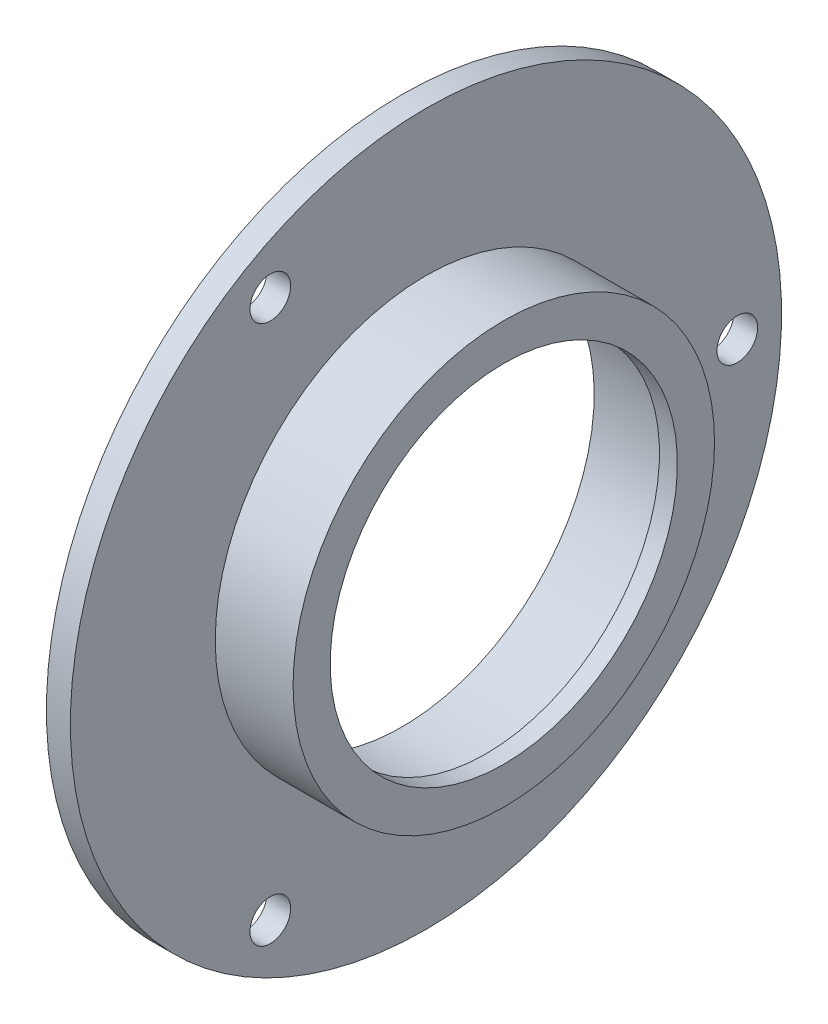
ISO-10303-21;
HEADER;
FILE_DESCRIPTION(('STEP AP214'),'2;1');
FILE_NAME('part.step','',(''),(''),'','','');
FILE_SCHEMA(('AUTOMOTIVE_DESIGN { 1 0 10303 214 1 1 1 1 }'));
ENDSEC;
DATA;
#1=APPLICATION_CONTEXT('core data for automotive mechanical design processes');
#2=APPLICATION_PROTOCOL_DEFINITION('international standard','automotive_design',2000,#1);
#3=PRODUCT_CONTEXT('',#1,'mechanical');
#4=PRODUCT('Part','Part','',(#3));
#5=PRODUCT_RELATED_PRODUCT_CATEGORY('part','',(#4));
#6=PRODUCT_DEFINITION_FORMATION('','',#4);
#7=PRODUCT_DEFINITION_CONTEXT('part definition',#1,'design');
#8=PRODUCT_DEFINITION('design','',#6,#7);
#9=PRODUCT_DEFINITION_SHAPE('','',#8);
#10=(LENGTH_UNIT() NAMED_UNIT(*) SI_UNIT(.MILLI.,.METRE.));
#11=(NAMED_UNIT(*) PLANE_ANGLE_UNIT() SI_UNIT($,.RADIAN.));
#12=(NAMED_UNIT(*) SI_UNIT($,.STERADIAN.) SOLID_ANGLE_UNIT());
#13=UNCERTAINTY_MEASURE_WITH_UNIT(LENGTH_MEASURE(1.E-05),#10,'distance_accuracy_value','');
#14=(GEOMETRIC_REPRESENTATION_CONTEXT(3) GLOBAL_UNCERTAINTY_ASSIGNED_CONTEXT((#13)) GLOBAL_UNIT_ASSIGNED_CONTEXT((#10,
#11,#12)) REPRESENTATION_CONTEXT('',''));
#15=CARTESIAN_POINT('',(0.,0.,0.));
#16=DIRECTION('',(0.,0.,1.));
#17=DIRECTION('',(1.,0.,0.));
#18=AXIS2_PLACEMENT_3D('',#15,#16,#17);
#19=CARTESIAN_POINT('',(-28.,0.,0.));
#20=DIRECTION('',(1.,0.,0.));
#21=DIRECTION('',(0.,1.,0.));
#22=AXIS2_PLACEMENT_3D('',#19,#20,#21);
#23=PLANE('',#22);
#24=CARTESIAN_POINT('',(-28.,0.,0.));
#25=DIRECTION('',(1.,0.,0.));
#26=DIRECTION('',(0.,1.,0.));
#27=AXIS2_PLACEMENT_3D('',#24,#25,#26);
#28=CIRCLE('',#27,14.5);
#29=CARTESIAN_POINT('',(-28.,14.5,0.));
#30=VERTEX_POINT('',#29);
#31=EDGE_CURVE('E25',#30,#30,#28,.T.);
#32=ORIENTED_EDGE('',*,*,#31,.F.);
#33=EDGE_LOOP('',(#32));
#34=FACE_BOUND('',#33,.T.);
#35=CARTESIAN_POINT('',(-28.,0.,0.));
#36=DIRECTION('',(1.,0.,0.));
#37=DIRECTION('',(0.,1.,0.));
#38=AXIS2_PLACEMENT_3D('',#35,#36,#37);
#39=CIRCLE('',#38,17.6);
#40=CARTESIAN_POINT('',(-28.,17.6,0.));
#41=VERTEX_POINT('',#40);
#42=EDGE_CURVE('E112',#41,#41,#39,.T.);
#43=ORIENTED_EDGE('',*,*,#42,.T.);
#44=EDGE_LOOP('',(#43));
#45=FACE_BOUND('',#44,.T.);
#46=ADVANCED_FACE('F14',(#34,#45),#23,.T.);
#47=CARTESIAN_POINT('',(-28.,0.,0.));
#48=DIRECTION('',(-1.,0.,0.));
#49=DIRECTION('',(0.,1.,0.));
#50=AXIS2_PLACEMENT_3D('',#47,#48,#49);
#51=CYLINDRICAL_SURFACE('',#50,14.5);
#52=ORIENTED_EDGE('',*,*,#31,.T.);
#53=DIRECTION('',(-1.,0.,0.));
#54=VECTOR('',#53,1.);
#55=CARTESIAN_POINT('',(-28.,14.5,0.));
#56=LINE('',#55,#54);
#57=CARTESIAN_POINT('',(-29.5,14.5,0.));
#58=VERTEX_POINT('',#57);
#59=EDGE_CURVE('E9',#30,#58,#56,.T.);
#60=ORIENTED_EDGE('',*,*,#59,.T.);
#61=CARTESIAN_POINT('',(-29.5,0.,0.));
#62=DIRECTION('',(1.,0.,0.));
#63=DIRECTION('',(0.,1.,0.));
#64=AXIS2_PLACEMENT_3D('',#61,#62,#63);
#65=CIRCLE('',#64,14.5);
#66=EDGE_CURVE('E114',#58,#58,#65,.T.);
#67=ORIENTED_EDGE('',*,*,#66,.F.);
#68=ORIENTED_EDGE('',*,*,#59,.F.);
#69=EDGE_LOOP('',(#52,#60,#67,#68));
#70=FACE_BOUND('',#69,.T.);
#71=ADVANCED_FACE('F211',(#70),#51,.F.);
#72=CARTESIAN_POINT('',(-34.5,0.,0.));
#73=DIRECTION('',(1.,0.,0.));
#74=DIRECTION('',(0.,1.,0.));
#75=AXIS2_PLACEMENT_3D('',#72,#73,#74);
#76=CYLINDRICAL_SURFACE('',#75,17.6);
#77=CARTESIAN_POINT('',(-34.5,0.,0.));
#78=DIRECTION('',(1.,0.,0.));
#79=DIRECTION('',(0.,1.,0.));
#80=AXIS2_PLACEMENT_3D('',#77,#78,#79);
#81=CIRCLE('',#80,17.6);
#82=CARTESIAN_POINT('',(-34.5,17.6,0.));
#83=VERTEX_POINT('',#82);
#84=EDGE_CURVE('E111',#83,#83,#81,.T.);
#85=ORIENTED_EDGE('',*,*,#84,.T.);
#86=DIRECTION('',(1.,0.,0.));
#87=VECTOR('',#86,1.);
#88=CARTESIAN_POINT('',(-34.5,17.6,0.));
#89=LINE('',#88,#87);
#90=EDGE_CURVE('E108',#83,#41,#89,.T.);
#91=ORIENTED_EDGE('',*,*,#90,.T.);
#92=ORIENTED_EDGE('',*,*,#42,.F.);
#93=ORIENTED_EDGE('',*,*,#90,.F.);
#94=EDGE_LOOP('',(#85,#91,#92,#93));
#95=FACE_BOUND('',#94,.T.);
#96=ADVANCED_FACE('F109',(#95),#76,.T.);
#97=CARTESIAN_POINT('',(-29.5,0.,0.));
#98=DIRECTION('',(1.,0.,0.));
#99=DIRECTION('',(0.,1.,0.));
#100=AXIS2_PLACEMENT_3D('',#97,#98,#99);
#101=PLANE('',#100);
#102=CARTESIAN_POINT('',(-29.5,0.,0.));
#103=DIRECTION('',(1.,0.,0.));
#104=DIRECTION('',(0.,1.,0.));
#105=AXIS2_PLACEMENT_3D('',#102,#103,#104);
#106=CIRCLE('',#105,16.05);
#107=CARTESIAN_POINT('',(-29.5,16.05,0.));
#108=VERTEX_POINT('',#107);
#109=EDGE_CURVE('E145',#108,#108,#106,.T.);
#110=ORIENTED_EDGE('',*,*,#109,.F.);
#111=EDGE_LOOP('',(#110));
#112=FACE_BOUND('',#111,.T.);
#113=ORIENTED_EDGE('',*,*,#66,.T.);
#114=EDGE_LOOP('',(#113));
#115=FACE_BOUND('',#114,.T.);
#116=ADVANCED_FACE('F196',(#112,#115),#101,.F.);
#117=CARTESIAN_POINT('',(-34.5,0.,0.));
#118=DIRECTION('',(1.,0.,0.));
#119=DIRECTION('',(0.,1.,0.));
#120=AXIS2_PLACEMENT_3D('',#117,#118,#119);
#121=PLANE('',#120);
#122=CARTESIAN_POINT('',(-34.5,22.516660498395,13.));
#123=DIRECTION('',(1.,0.,0.));
#124=DIRECTION('',(0.,0.,-1.));
#125=AXIS2_PLACEMENT_3D('',#122,#123,#124);
#126=CIRCLE('',#125,1.7);
#127=CARTESIAN_POINT('',(-34.5,22.516660498395,11.3));
#128=VERTEX_POINT('',#127);
#129=EDGE_CURVE('E142',#128,#128,#126,.T.);
#130=ORIENTED_EDGE('',*,*,#129,.F.);
#131=EDGE_LOOP('',(#130));
#132=FACE_BOUND('',#131,.T.);
#133=ORIENTED_EDGE('',*,*,#84,.F.);
#134=EDGE_LOOP('',(#133));
#135=FACE_BOUND('',#134,.T.);
#136=CARTESIAN_POINT('',(-34.5,-22.51666049839,13.));
#137=DIRECTION('',(1.,0.,0.));
#138=DIRECTION('',(0.,0.,-1.));
#139=AXIS2_PLACEMENT_3D('',#136,#137,#138);
#140=CIRCLE('',#139,1.7);
#141=CARTESIAN_POINT('',(-34.5,-22.51666049839,11.3));
#142=VERTEX_POINT('',#141);
#143=EDGE_CURVE('E100',#142,#142,#140,.T.);
#144=ORIENTED_EDGE('',*,*,#143,.F.);
#145=EDGE_LOOP('',(#144));
#146=FACE_BOUND('',#145,.T.);
#147=CARTESIAN_POINT('',(-34.5,0.,-26.));
#148=DIRECTION('',(1.,0.,0.));
#149=DIRECTION('',(0.,0.,-1.));
#150=AXIS2_PLACEMENT_3D('',#147,#148,#149);
#151=CIRCLE('',#150,1.7);
#152=CARTESIAN_POINT('',(-34.5,0.,-27.7));
#153=VERTEX_POINT('',#152);
#154=EDGE_CURVE('E138',#153,#153,#151,.T.);
#155=ORIENTED_EDGE('',*,*,#154,.F.);
#156=EDGE_LOOP('',(#155));
#157=FACE_BOUND('',#156,.T.);
#158=CARTESIAN_POINT('',(-34.5,0.,0.));
#159=DIRECTION('',(1.,0.,0.));
#160=DIRECTION('',(0.,1.,0.));
#161=AXIS2_PLACEMENT_3D('',#158,#159,#160);
#162=CIRCLE('',#161,29.7);
#163=CARTESIAN_POINT('',(-34.5,29.7,0.));
#164=VERTEX_POINT('',#163);
#165=EDGE_CURVE('E139',#164,#164,#162,.T.);
#166=ORIENTED_EDGE('',*,*,#165,.T.);
#167=EDGE_LOOP('',(#166));
#168=FACE_BOUND('',#167,.T.);
#169=ADVANCED_FACE('F193',(#132,#135,#146,#157,#168),#121,.T.);
#170=CARTESIAN_POINT('',(-36.6,-22.51666049839,13.));
#171=DIRECTION('',(1.,0.,0.));
#172=DIRECTION('',(0.,0.,-1.));
#173=AXIS2_PLACEMENT_3D('',#170,#171,#172);
#174=CYLINDRICAL_SURFACE('',#173,1.7);
#175=DIRECTION('',(1.,0.,0.));
#176=VECTOR('',#175,1.);
#177=CARTESIAN_POINT('',(-36.6,-22.51666049839,11.3));
#178=LINE('',#177,#176);
#179=CARTESIAN_POINT('',(-36.5,-22.51666049839,11.3));
#180=VERTEX_POINT('',#179);
#181=EDGE_CURVE('E147',#180,#142,#178,.T.);
#182=ORIENTED_EDGE('',*,*,#181,.F.);
#183=CARTESIAN_POINT('',(-36.5,-22.51666049839,13.));
#184=DIRECTION('',(1.,0.,0.));
#185=DIRECTION('',(0.,0.,-1.));
#186=AXIS2_PLACEMENT_3D('',#183,#184,#185);
#187=CIRCLE('',#186,1.7);
#188=EDGE_CURVE('E131',#180,#180,#187,.T.);
#189=ORIENTED_EDGE('',*,*,#188,.F.);
#190=ORIENTED_EDGE('',*,*,#181,.T.);
#191=ORIENTED_EDGE('',*,*,#143,.T.);
#192=EDGE_LOOP('',(#182,#189,#190,#191));
#193=FACE_BOUND('',#192,.T.);
#194=ADVANCED_FACE('F195',(#193),#174,.F.);
#195=CARTESIAN_POINT('',(-29.5,0.,0.));
#196=DIRECTION('',(-1.,0.,0.));
#197=DIRECTION('',(0.,1.,0.));
#198=AXIS2_PLACEMENT_3D('',#195,#196,#197);
#199=CYLINDRICAL_SURFACE('',#198,16.05);
#200=ORIENTED_EDGE('',*,*,#109,.T.);
#201=DIRECTION('',(-1.,0.,0.));
#202=VECTOR('',#201,1.);
#203=CARTESIAN_POINT('',(-29.5,16.05,0.));
#204=LINE('',#203,#202);
#205=CARTESIAN_POINT('',(-36.5,16.05,0.));
#206=VERTEX_POINT('',#205);
#207=EDGE_CURVE('E93',#108,#206,#204,.T.);
#208=ORIENTED_EDGE('',*,*,#207,.T.);
#209=CARTESIAN_POINT('',(-36.5,0.,0.));
#210=DIRECTION('',(1.,0.,0.));
#211=DIRECTION('',(0.,1.,0.));
#212=AXIS2_PLACEMENT_3D('',#209,#210,#211);
#213=CIRCLE('',#212,16.05);
#214=EDGE_CURVE('E135',#206,#206,#213,.T.);
#215=ORIENTED_EDGE('',*,*,#214,.F.);
#216=ORIENTED_EDGE('',*,*,#207,.F.);
#217=EDGE_LOOP('',(#200,#208,#215,#216));
#218=FACE_BOUND('',#217,.T.);
#219=ADVANCED_FACE('F16',(#218),#199,.F.);
#220=CARTESIAN_POINT('',(-36.6,22.516660498395,13.));
#221=DIRECTION('',(1.,0.,0.));
#222=DIRECTION('',(0.,0.,-1.));
#223=AXIS2_PLACEMENT_3D('',#220,#221,#222);
#224=CYLINDRICAL_SURFACE('',#223,1.7);
#225=DIRECTION('',(1.,0.,0.));
#226=VECTOR('',#225,1.);
#227=CARTESIAN_POINT('',(-36.6,22.516660498395,11.3));
#228=LINE('',#227,#226);
#229=CARTESIAN_POINT('',(-36.5,22.516660498395,11.3));
#230=VERTEX_POINT('',#229);
#231=EDGE_CURVE('E146',#230,#128,#228,.T.);
#232=ORIENTED_EDGE('',*,*,#231,.F.);
#233=CARTESIAN_POINT('',(-36.5,22.516660498395,13.));
#234=DIRECTION('',(1.,0.,0.));
#235=DIRECTION('',(0.,0.,-1.));
#236=AXIS2_PLACEMENT_3D('',#233,#234,#235);
#237=CIRCLE('',#236,1.7);
#238=EDGE_CURVE('E152',#230,#230,#237,.T.);
#239=ORIENTED_EDGE('',*,*,#238,.F.);
#240=ORIENTED_EDGE('',*,*,#231,.T.);
#241=ORIENTED_EDGE('',*,*,#129,.T.);
#242=EDGE_LOOP('',(#232,#239,#240,#241));
#243=FACE_BOUND('',#242,.T.);
#244=ADVANCED_FACE('F223',(#243),#224,.F.);
#245=CARTESIAN_POINT('',(-36.6,0.,-26.));
#246=DIRECTION('',(1.,0.,0.));
#247=DIRECTION('',(0.,0.,-1.));
#248=AXIS2_PLACEMENT_3D('',#245,#246,#247);
#249=CYLINDRICAL_SURFACE('',#248,1.7);
#250=DIRECTION('',(1.,0.,0.));
#251=VECTOR('',#250,1.);
#252=CARTESIAN_POINT('',(-36.6,0.,-27.7));
#253=LINE('',#252,#251);
#254=CARTESIAN_POINT('',(-36.5,0.,-27.7));
#255=VERTEX_POINT('',#254);
#256=EDGE_CURVE('E69',#255,#153,#253,.T.);
#257=ORIENTED_EDGE('',*,*,#256,.F.);
#258=CARTESIAN_POINT('',(-36.5,0.,-26.));
#259=DIRECTION('',(1.,0.,0.));
#260=DIRECTION('',(0.,0.,-1.));
#261=AXIS2_PLACEMENT_3D('',#258,#259,#260);
#262=CIRCLE('',#261,1.7);
#263=EDGE_CURVE('E18',#255,#255,#262,.T.);
#264=ORIENTED_EDGE('',*,*,#263,.F.);
#265=ORIENTED_EDGE('',*,*,#256,.T.);
#266=ORIENTED_EDGE('',*,*,#154,.T.);
#267=EDGE_LOOP('',(#257,#264,#265,#266));
#268=FACE_BOUND('',#267,.T.);
#269=ADVANCED_FACE('F220',(#268),#249,.F.);
#270=CARTESIAN_POINT('',(-36.5,0.,0.));
#271=DIRECTION('',(1.,0.,0.));
#272=DIRECTION('',(0.,1.,0.));
#273=AXIS2_PLACEMENT_3D('',#270,#271,#272);
#274=CYLINDRICAL_SURFACE('',#273,29.7);
#275=CARTESIAN_POINT('',(-36.5,0.,0.));
#276=DIRECTION('',(1.,0.,0.));
#277=DIRECTION('',(0.,1.,0.));
#278=AXIS2_PLACEMENT_3D('',#275,#276,#277);
#279=CIRCLE('',#278,29.7);
#280=CARTESIAN_POINT('',(-36.5,29.7,0.));
#281=VERTEX_POINT('',#280);
#282=EDGE_CURVE('E127',#281,#281,#279,.T.);
#283=ORIENTED_EDGE('',*,*,#282,.T.);
#284=DIRECTION('',(1.,0.,0.));
#285=VECTOR('',#284,1.);
#286=CARTESIAN_POINT('',(-36.5,29.7,0.));
#287=LINE('',#286,#285);
#288=EDGE_CURVE('E57',#281,#164,#287,.T.);
#289=ORIENTED_EDGE('',*,*,#288,.T.);
#290=ORIENTED_EDGE('',*,*,#165,.F.);
#291=ORIENTED_EDGE('',*,*,#288,.F.);
#292=EDGE_LOOP('',(#283,#289,#290,#291));
#293=FACE_BOUND('',#292,.T.);
#294=ADVANCED_FACE('F186',(#293),#274,.T.);
#295=CARTESIAN_POINT('',(-36.5,0.,0.));
#296=DIRECTION('',(1.,0.,0.));
#297=DIRECTION('',(0.,1.,0.));
#298=AXIS2_PLACEMENT_3D('',#295,#296,#297);
#299=PLANE('',#298);
#300=ORIENTED_EDGE('',*,*,#188,.T.);
#301=EDGE_LOOP('',(#300));
#302=FACE_BOUND('',#301,.T.);
#303=ORIENTED_EDGE('',*,*,#214,.T.);
#304=EDGE_LOOP('',(#303));
#305=FACE_BOUND('',#304,.T.);
#306=ORIENTED_EDGE('',*,*,#238,.T.);
#307=EDGE_LOOP('',(#306));
#308=FACE_BOUND('',#307,.T.);
#309=ORIENTED_EDGE('',*,*,#263,.T.);
#310=EDGE_LOOP('',(#309));
#311=FACE_BOUND('',#310,.T.);
#312=ORIENTED_EDGE('',*,*,#282,.F.);
#313=EDGE_LOOP('',(#312));
#314=FACE_BOUND('',#313,.T.);
#315=ADVANCED_FACE('F183',(#302,#305,#308,#311,#314),#299,.F.);
#316=CLOSED_SHELL('',(#46,#71,#96,#116,#169,#194,#219,#244,#269,#294,#315));
#317=MANIFOLD_SOLID_BREP('B1',#316);
#318=ADVANCED_BREP_SHAPE_REPRESENTATION('',(#18,#317),#14);
#319=SHAPE_DEFINITION_REPRESENTATION(#9,#318);
ENDSEC;
END-ISO-10303-21;
